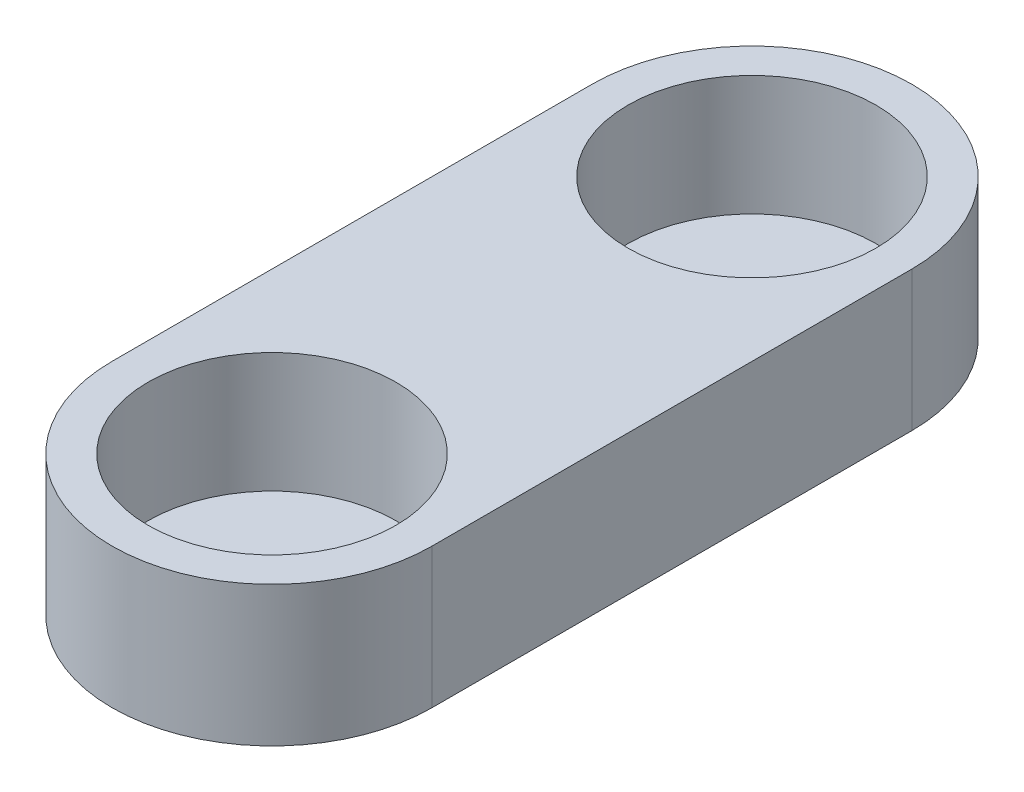
ISO-10303-21;
HEADER;
FILE_DESCRIPTION(('STEP AP214'),'2;1');
FILE_NAME('part.step','',(''),(''),'','','');
FILE_SCHEMA(('AUTOMOTIVE_DESIGN { 1 0 10303 214 1 1 1 1 }'));
ENDSEC;
DATA;
#1=APPLICATION_CONTEXT('core data for automotive mechanical design processes');
#2=APPLICATION_PROTOCOL_DEFINITION('international standard','automotive_design',2000,#1);
#3=PRODUCT_CONTEXT('',#1,'mechanical');
#4=PRODUCT('Part','Part','',(#3));
#5=PRODUCT_RELATED_PRODUCT_CATEGORY('part','',(#4));
#6=PRODUCT_DEFINITION_FORMATION('','',#4);
#7=PRODUCT_DEFINITION_CONTEXT('part definition',#1,'design');
#8=PRODUCT_DEFINITION('design','',#6,#7);
#9=PRODUCT_DEFINITION_SHAPE('','',#8);
#10=(LENGTH_UNIT() NAMED_UNIT(*) SI_UNIT(.MILLI.,.METRE.));
#11=(NAMED_UNIT(*) PLANE_ANGLE_UNIT() SI_UNIT($,.RADIAN.));
#12=(NAMED_UNIT(*) SI_UNIT($,.STERADIAN.) SOLID_ANGLE_UNIT());
#13=UNCERTAINTY_MEASURE_WITH_UNIT(LENGTH_MEASURE(1.E-05),#10,'distance_accuracy_value','');
#14=(GEOMETRIC_REPRESENTATION_CONTEXT(3) GLOBAL_UNCERTAINTY_ASSIGNED_CONTEXT((#13)) GLOBAL_UNIT_ASSIGNED_CONTEXT((#10,
#11,#12)) REPRESENTATION_CONTEXT('',''));
#15=CARTESIAN_POINT('',(0.,0.,0.));
#16=DIRECTION('',(0.,0.,1.));
#17=DIRECTION('',(1.,0.,0.));
#18=AXIS2_PLACEMENT_3D('',#15,#16,#17);
#19=CARTESIAN_POINT('',(0.,3.,-6.));
#20=DIRECTION('',(0.,1.,0.));
#21=DIRECTION('',(0.,0.,1.));
#22=AXIS2_PLACEMENT_3D('',#19,#20,#21);
#23=PLANE('',#22);
#24=CARTESIAN_POINT('',(0.,3.,-6.));
#25=DIRECTION('',(0.,1.,0.));
#26=DIRECTION('',(0.,0.,1.));
#27=AXIS2_PLACEMENT_3D('',#24,#25,#26);
#28=CIRCLE('',#27,3.1);
#29=CARTESIAN_POINT('',(0.,3.,-2.9));
#30=VERTEX_POINT('',#29);
#31=EDGE_CURVE('E114',#30,#30,#28,.T.);
#32=ORIENTED_EDGE('',*,*,#31,.F.);
#33=EDGE_LOOP('',(#32));
#34=FACE_BOUND('',#33,.T.);
#35=CARTESIAN_POINT('',(0.,3.,-6.));
#36=DIRECTION('',(0.,1.,0.));
#37=DIRECTION('',(0.,0.,1.));
#38=AXIS2_PLACEMENT_3D('',#35,#36,#37);
#39=CIRCLE('',#38,4.);
#40=CARTESIAN_POINT('',(4.,3.,-6.));
#41=VERTEX_POINT('',#40);
#42=CARTESIAN_POINT('',(-4.,3.,-6.));
#43=VERTEX_POINT('',#42);
#44=EDGE_CURVE('E117',#41,#43,#39,.T.);
#45=ORIENTED_EDGE('',*,*,#44,.T.);
#46=DIRECTION('',(0.,0.,1.));
#47=VECTOR('',#46,1.);
#48=CARTESIAN_POINT('',(-4.,3.,-6.));
#49=LINE('',#48,#47);
#50=CARTESIAN_POINT('',(-4.,3.,6.));
#51=VERTEX_POINT('',#50);
#52=EDGE_CURVE('E121',#43,#51,#49,.T.);
#53=ORIENTED_EDGE('',*,*,#52,.T.);
#54=CARTESIAN_POINT('',(0.,3.,6.));
#55=DIRECTION('',(0.,1.,0.));
#56=DIRECTION('',(0.,0.,1.));
#57=AXIS2_PLACEMENT_3D('',#54,#55,#56);
#58=CIRCLE('',#57,4.);
#59=CARTESIAN_POINT('',(4.,3.,6.));
#60=VERTEX_POINT('',#59);
#61=EDGE_CURVE('E59',#51,#60,#58,.T.);
#62=ORIENTED_EDGE('',*,*,#61,.T.);
#63=DIRECTION('',(0.,0.,-1.));
#64=VECTOR('',#63,1.);
#65=CARTESIAN_POINT('',(4.,3.,-6.));
#66=LINE('',#65,#64);
#67=EDGE_CURVE('E54',#60,#41,#66,.T.);
#68=ORIENTED_EDGE('',*,*,#67,.T.);
#69=EDGE_LOOP('',(#45,#53,#62,#68));
#70=FACE_BOUND('',#69,.T.);
#71=CARTESIAN_POINT('',(0.,3.,6.));
#72=DIRECTION('',(0.,1.,0.));
#73=DIRECTION('',(0.,0.,1.));
#74=AXIS2_PLACEMENT_3D('',#71,#72,#73);
#75=CIRCLE('',#74,3.1);
#76=CARTESIAN_POINT('',(0.,3.,9.1));
#77=VERTEX_POINT('',#76);
#78=EDGE_CURVE('E108',#77,#77,#75,.T.);
#79=ORIENTED_EDGE('',*,*,#78,.F.);
#80=EDGE_LOOP('',(#79));
#81=FACE_BOUND('',#80,.T.);
#82=ADVANCED_FACE('F39',(#34,#70,#81),#23,.T.);
#83=CARTESIAN_POINT('',(0.,3.,-6.));
#84=DIRECTION('',(0.,-1.,0.));
#85=DIRECTION('',(0.,0.,-1.));
#86=AXIS2_PLACEMENT_3D('',#83,#84,#85);
#87=CYLINDRICAL_SURFACE('',#86,4.);
#88=DIRECTION('',(0.,-1.,0.));
#89=VECTOR('',#88,1.);
#90=CARTESIAN_POINT('',(4.,3.,-6.));
#91=LINE('',#90,#89);
#92=CARTESIAN_POINT('',(4.,-0.5,-6.));
#93=VERTEX_POINT('',#92);
#94=EDGE_CURVE('E125',#41,#93,#91,.T.);
#95=ORIENTED_EDGE('',*,*,#94,.T.);
#96=CARTESIAN_POINT('',(0.,-0.5,-6.));
#97=DIRECTION('',(0.,-1.,0.));
#98=DIRECTION('',(0.,0.,-1.));
#99=AXIS2_PLACEMENT_3D('',#96,#97,#98);
#100=CIRCLE('',#99,4.);
#101=CARTESIAN_POINT('',(-4.,-0.5,-6.));
#102=VERTEX_POINT('',#101);
#103=EDGE_CURVE('E92',#102,#93,#100,.T.);
#104=ORIENTED_EDGE('',*,*,#103,.F.);
#105=DIRECTION('',(0.,-1.,0.));
#106=VECTOR('',#105,1.);
#107=CARTESIAN_POINT('',(-4.,3.,-6.));
#108=LINE('',#107,#106);
#109=EDGE_CURVE('E11',#43,#102,#108,.T.);
#110=ORIENTED_EDGE('',*,*,#109,.F.);
#111=ORIENTED_EDGE('',*,*,#44,.F.);
#112=EDGE_LOOP('',(#95,#104,#110,#111));
#113=FACE_BOUND('',#112,.T.);
#114=ADVANCED_FACE('F41',(#113),#87,.T.);
#115=CARTESIAN_POINT('',(-4.,3.,-6.));
#116=DIRECTION('',(1.,0.,0.));
#117=DIRECTION('',(0.,0.,-1.));
#118=AXIS2_PLACEMENT_3D('',#115,#116,#117);
#119=PLANE('',#118);
#120=ORIENTED_EDGE('',*,*,#109,.T.);
#121=DIRECTION('',(0.,0.,-1.));
#122=VECTOR('',#121,1.);
#123=CARTESIAN_POINT('',(-4.,-0.5,6.));
#124=LINE('',#123,#122);
#125=CARTESIAN_POINT('',(-4.,-0.5,6.));
#126=VERTEX_POINT('',#125);
#127=EDGE_CURVE('E86',#126,#102,#124,.T.);
#128=ORIENTED_EDGE('',*,*,#127,.F.);
#129=DIRECTION('',(0.,-1.,0.));
#130=VECTOR('',#129,1.);
#131=CARTESIAN_POINT('',(-4.,3.,6.));
#132=LINE('',#131,#130);
#133=EDGE_CURVE('E47',#51,#126,#132,.T.);
#134=ORIENTED_EDGE('',*,*,#133,.F.);
#135=ORIENTED_EDGE('',*,*,#52,.F.);
#136=EDGE_LOOP('',(#120,#128,#134,#135));
#137=FACE_BOUND('',#136,.T.);
#138=ADVANCED_FACE('F87',(#137),#119,.F.);
#139=CARTESIAN_POINT('',(0.,3.,6.));
#140=DIRECTION('',(0.,-1.,0.));
#141=DIRECTION('',(0.,0.,-1.));
#142=AXIS2_PLACEMENT_3D('',#139,#140,#141);
#143=CYLINDRICAL_SURFACE('',#142,4.);
#144=ORIENTED_EDGE('',*,*,#133,.T.);
#145=CARTESIAN_POINT('',(0.,-0.5,6.));
#146=DIRECTION('',(0.,-1.,0.));
#147=DIRECTION('',(0.,0.,-1.));
#148=AXIS2_PLACEMENT_3D('',#145,#146,#147);
#149=CIRCLE('',#148,4.);
#150=CARTESIAN_POINT('',(4.,-0.5,6.));
#151=VERTEX_POINT('',#150);
#152=EDGE_CURVE('E82',#151,#126,#149,.T.);
#153=ORIENTED_EDGE('',*,*,#152,.F.);
#154=DIRECTION('',(0.,-1.,0.));
#155=VECTOR('',#154,1.);
#156=CARTESIAN_POINT('',(4.,3.,6.));
#157=LINE('',#156,#155);
#158=EDGE_CURVE('E84',#60,#151,#157,.T.);
#159=ORIENTED_EDGE('',*,*,#158,.F.);
#160=ORIENTED_EDGE('',*,*,#61,.F.);
#161=EDGE_LOOP('',(#144,#153,#159,#160));
#162=FACE_BOUND('',#161,.T.);
#163=ADVANCED_FACE('F80',(#162),#143,.T.);
#164=CARTESIAN_POINT('',(4.,3.,-6.));
#165=DIRECTION('',(-1.,0.,0.));
#166=DIRECTION('',(0.,0.,1.));
#167=AXIS2_PLACEMENT_3D('',#164,#165,#166);
#168=PLANE('',#167);
#169=ORIENTED_EDGE('',*,*,#158,.T.);
#170=DIRECTION('',(0.,0.,1.));
#171=VECTOR('',#170,1.);
#172=CARTESIAN_POINT('',(4.,-0.5,6.));
#173=LINE('',#172,#171);
#174=EDGE_CURVE('E97',#93,#151,#173,.T.);
#175=ORIENTED_EDGE('',*,*,#174,.F.);
#176=ORIENTED_EDGE('',*,*,#94,.F.);
#177=ORIENTED_EDGE('',*,*,#67,.F.);
#178=EDGE_LOOP('',(#169,#175,#176,#177));
#179=FACE_BOUND('',#178,.T.);
#180=ADVANCED_FACE('F128',(#179),#168,.F.);
#181=CARTESIAN_POINT('',(0.,3.,-6.));
#182=DIRECTION('',(0.,-1.,0.));
#183=DIRECTION('',(0.,0.,-1.));
#184=AXIS2_PLACEMENT_3D('',#181,#182,#183);
#185=CYLINDRICAL_SURFACE('',#184,3.1);
#186=ORIENTED_EDGE('',*,*,#31,.T.);
#187=EDGE_LOOP('',(#186));
#188=FACE_BOUND('',#187,.T.);
#189=CARTESIAN_POINT('',(0.,0.,-6.));
#190=DIRECTION('',(0.,1.,0.));
#191=DIRECTION('',(0.,0.,1.));
#192=AXIS2_PLACEMENT_3D('',#189,#190,#191);
#193=CIRCLE('',#192,3.1);
#194=CARTESIAN_POINT('',(0.,0.,-2.9));
#195=VERTEX_POINT('',#194);
#196=EDGE_CURVE('E111',#195,#195,#193,.T.);
#197=ORIENTED_EDGE('',*,*,#196,.F.);
#198=EDGE_LOOP('',(#197));
#199=FACE_BOUND('',#198,.T.);
#200=ADVANCED_FACE('F141',(#188,#199),#185,.F.);
#201=CARTESIAN_POINT('',(0.,3.,6.));
#202=DIRECTION('',(0.,-1.,0.));
#203=DIRECTION('',(0.,0.,-1.));
#204=AXIS2_PLACEMENT_3D('',#201,#202,#203);
#205=CYLINDRICAL_SURFACE('',#204,3.1);
#206=ORIENTED_EDGE('',*,*,#78,.T.);
#207=EDGE_LOOP('',(#206));
#208=FACE_BOUND('',#207,.T.);
#209=CARTESIAN_POINT('',(0.,0.,6.));
#210=DIRECTION('',(0.,1.,0.));
#211=DIRECTION('',(0.,0.,1.));
#212=AXIS2_PLACEMENT_3D('',#209,#210,#211);
#213=CIRCLE('',#212,3.1);
#214=CARTESIAN_POINT('',(0.,0.,9.1));
#215=VERTEX_POINT('',#214);
#216=EDGE_CURVE('E107',#215,#215,#213,.T.);
#217=ORIENTED_EDGE('',*,*,#216,.F.);
#218=EDGE_LOOP('',(#217));
#219=FACE_BOUND('',#218,.T.);
#220=ADVANCED_FACE('F137',(#208,#219),#205,.F.);
#221=CARTESIAN_POINT('',(0.,0.,6.));
#222=DIRECTION('',(0.,-1.,0.));
#223=DIRECTION('',(0.,0.,-1.));
#224=AXIS2_PLACEMENT_3D('',#221,#222,#223);
#225=PLANE('',#224);
#226=CARTESIAN_POINT('',(0.,0.,6.));
#227=DIRECTION('',(0.,-1.,0.));
#228=DIRECTION('',(0.,0.,-1.));
#229=AXIS2_PLACEMENT_3D('',#226,#227,#228);
#230=CIRCLE('',#229,1.);
#231=CARTESIAN_POINT('',(0.,0.,5.));
#232=VERTEX_POINT('',#231);
#233=EDGE_CURVE('E278',#232,#232,#230,.T.);
#234=ORIENTED_EDGE('',*,*,#233,.T.);
#235=EDGE_LOOP('',(#234));
#236=FACE_BOUND('',#235,.T.);
#237=ORIENTED_EDGE('',*,*,#216,.T.);
#238=EDGE_LOOP('',(#237));
#239=FACE_BOUND('',#238,.T.);
#240=ADVANCED_FACE('F140',(#236,#239),#225,.F.);
#241=CARTESIAN_POINT('',(0.,0.,-6.));
#242=DIRECTION('',(0.,-1.,0.));
#243=DIRECTION('',(0.,0.,-1.));
#244=AXIS2_PLACEMENT_3D('',#241,#242,#243);
#245=CIRCLE('',#244,1.);
#246=CARTESIAN_POINT('',(0.,0.,-7.));
#247=VERTEX_POINT('',#246);
#248=EDGE_CURVE('E279',#247,#247,#245,.T.);
#249=ORIENTED_EDGE('',*,*,#248,.T.);
#250=EDGE_LOOP('',(#249));
#251=FACE_BOUND('',#250,.T.);
#252=ORIENTED_EDGE('',*,*,#196,.T.);
#253=EDGE_LOOP('',(#252));
#254=FACE_BOUND('',#253,.T.);
#255=ADVANCED_FACE('F146',(#251,#254),#225,.F.);
#256=CARTESIAN_POINT('',(0.,-0.5,6.));
#257=DIRECTION('',(0.,-1.,0.));
#258=DIRECTION('',(0.,0.,-1.));
#259=AXIS2_PLACEMENT_3D('',#256,#257,#258);
#260=PLANE('',#259);
#261=CARTESIAN_POINT('',(0.,-0.5,6.));
#262=DIRECTION('',(0.,-1.,0.));
#263=DIRECTION('',(0.,0.,-1.));
#264=AXIS2_PLACEMENT_3D('',#261,#262,#263);
#265=CIRCLE('',#264,1.);
#266=CARTESIAN_POINT('',(0.,-0.5,5.));
#267=VERTEX_POINT('',#266);
#268=EDGE_CURVE('E276',#267,#267,#265,.T.);
#269=ORIENTED_EDGE('',*,*,#268,.F.);
#270=EDGE_LOOP('',(#269));
#271=FACE_BOUND('',#270,.T.);
#272=CARTESIAN_POINT('',(0.,-0.5,-6.));
#273=DIRECTION('',(0.,-1.,0.));
#274=DIRECTION('',(0.,0.,-1.));
#275=AXIS2_PLACEMENT_3D('',#272,#273,#274);
#276=CIRCLE('',#275,1.);
#277=CARTESIAN_POINT('',(0.,-0.5,-7.));
#278=VERTEX_POINT('',#277);
#279=EDGE_CURVE('E285',#278,#278,#276,.T.);
#280=ORIENTED_EDGE('',*,*,#279,.F.);
#281=EDGE_LOOP('',(#280));
#282=FACE_BOUND('',#281,.T.);
#283=CARTESIAN_POINT('',(0.,-0.5,0.));
#284=DIRECTION('',(0.,-1.,0.));
#285=DIRECTION('',(0.,0.,-1.));
#286=AXIS2_PLACEMENT_3D('',#283,#284,#285);
#287=CIRCLE('',#286,0.85);
#288=CARTESIAN_POINT('',(0.,-0.5,-0.85));
#289=VERTEX_POINT('',#288);
#290=EDGE_CURVE('E101',#289,#289,#287,.T.);
#291=ORIENTED_EDGE('',*,*,#290,.F.);
#292=EDGE_LOOP('',(#291));
#293=FACE_BOUND('',#292,.T.);
#294=ORIENTED_EDGE('',*,*,#152,.T.);
#295=ORIENTED_EDGE('',*,*,#127,.T.);
#296=ORIENTED_EDGE('',*,*,#103,.T.);
#297=ORIENTED_EDGE('',*,*,#174,.T.);
#298=EDGE_LOOP('',(#294,#295,#296,#297));
#299=FACE_BOUND('',#298,.T.);
#300=ADVANCED_FACE('F95',(#271,#282,#293,#299),#260,.T.);
#301=CARTESIAN_POINT('',(0.,2.,0.));
#302=DIRECTION('',(0.,-1.,0.));
#303=DIRECTION('',(0.,0.,-1.));
#304=AXIS2_PLACEMENT_3D('',#301,#302,#303);
#305=CYLINDRICAL_SURFACE('',#304,0.85);
#306=CARTESIAN_POINT('',(0.,2.,0.));
#307=DIRECTION('',(0.,-1.,0.));
#308=DIRECTION('',(0.,0.,-1.));
#309=AXIS2_PLACEMENT_3D('',#306,#307,#308);
#310=CIRCLE('',#309,0.85);
#311=CARTESIAN_POINT('',(0.,2.,-0.85));
#312=VERTEX_POINT('',#311);
#313=EDGE_CURVE('E98',#312,#312,#310,.T.);
#314=ORIENTED_EDGE('',*,*,#313,.F.);
#315=EDGE_LOOP('',(#314));
#316=FACE_BOUND('',#315,.T.);
#317=ORIENTED_EDGE('',*,*,#290,.T.);
#318=EDGE_LOOP('',(#317));
#319=FACE_BOUND('',#318,.T.);
#320=ADVANCED_FACE('F234',(#316,#319),#305,.F.);
#321=CARTESIAN_POINT('',(0.,2.,0.));
#322=DIRECTION('',(0.,-1.,0.));
#323=DIRECTION('',(0.,0.,-1.));
#324=AXIS2_PLACEMENT_3D('',#321,#322,#323);
#325=PLANE('',#324);
#326=ORIENTED_EDGE('',*,*,#313,.T.);
#327=EDGE_LOOP('',(#326));
#328=FACE_BOUND('',#327,.T.);
#329=ADVANCED_FACE('F243',(#328),#325,.T.);
#330=CARTESIAN_POINT('',(0.,3.,-6.));
#331=DIRECTION('',(0.,-1.,0.));
#332=DIRECTION('',(0.,0.,-1.));
#333=AXIS2_PLACEMENT_3D('',#330,#331,#332);
#334=CYLINDRICAL_SURFACE('',#333,1.);
#335=ORIENTED_EDGE('',*,*,#279,.T.);
#336=EDGE_LOOP('',(#335));
#337=FACE_BOUND('',#336,.T.);
#338=ORIENTED_EDGE('',*,*,#248,.F.);
#339=EDGE_LOOP('',(#338));
#340=FACE_BOUND('',#339,.T.);
#341=ADVANCED_FACE('F251',(#337,#340),#334,.F.);
#342=CARTESIAN_POINT('',(0.,3.,6.));
#343=DIRECTION('',(0.,-1.,0.));
#344=DIRECTION('',(0.,0.,-1.));
#345=AXIS2_PLACEMENT_3D('',#342,#343,#344);
#346=CYLINDRICAL_SURFACE('',#345,1.);
#347=ORIENTED_EDGE('',*,*,#268,.T.);
#348=EDGE_LOOP('',(#347));
#349=FACE_BOUND('',#348,.T.);
#350=ORIENTED_EDGE('',*,*,#233,.F.);
#351=EDGE_LOOP('',(#350));
#352=FACE_BOUND('',#351,.T.);
#353=ADVANCED_FACE('F260',(#349,#352),#346,.F.);
#354=CLOSED_SHELL('',(#82,#114,#138,#163,#180,#200,#220,#240,#255,#300,#320,#329,#341,#353));
#355=MANIFOLD_SOLID_BREP('B2',#354);
#356=ADVANCED_BREP_SHAPE_REPRESENTATION('',(#18,#355),#14);
#357=SHAPE_DEFINITION_REPRESENTATION(#9,#356);
ENDSEC;
END-ISO-10303-21;
